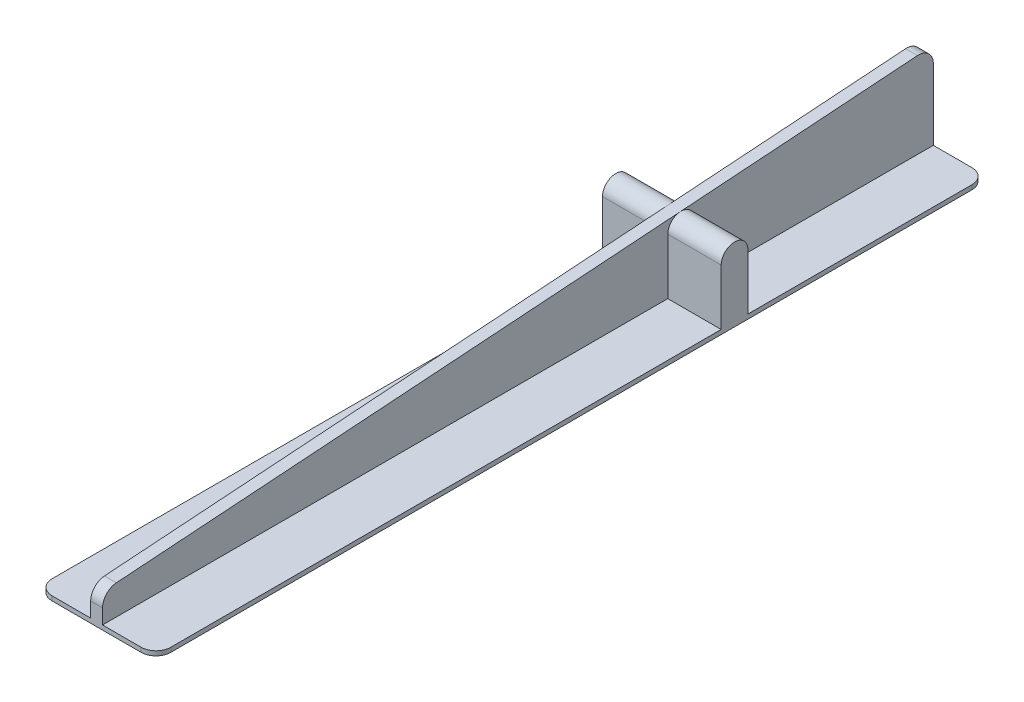
ISO-10303-21;
HEADER;
FILE_DESCRIPTION(('STEP AP214'),'2;1');
FILE_NAME('part.step','',(''),(''),'','','');
FILE_SCHEMA(('AUTOMOTIVE_DESIGN { 1 0 10303 214 1 1 1 1 }'));
ENDSEC;
DATA;
#1=APPLICATION_CONTEXT('core data for automotive mechanical design processes');
#2=APPLICATION_PROTOCOL_DEFINITION('international standard','automotive_design',2000,#1);
#3=PRODUCT_CONTEXT('',#1,'mechanical');
#4=PRODUCT('Part','Part','',(#3));
#5=PRODUCT_RELATED_PRODUCT_CATEGORY('part','',(#4));
#6=PRODUCT_DEFINITION_FORMATION('','',#4);
#7=PRODUCT_DEFINITION_CONTEXT('part definition',#1,'design');
#8=PRODUCT_DEFINITION('design','',#6,#7);
#9=PRODUCT_DEFINITION_SHAPE('','',#8);
#10=(LENGTH_UNIT() NAMED_UNIT(*) SI_UNIT(.MILLI.,.METRE.));
#11=(NAMED_UNIT(*) PLANE_ANGLE_UNIT() SI_UNIT($,.RADIAN.));
#12=(NAMED_UNIT(*) SI_UNIT($,.STERADIAN.) SOLID_ANGLE_UNIT());
#13=UNCERTAINTY_MEASURE_WITH_UNIT(LENGTH_MEASURE(1.E-05),#10,'distance_accuracy_value','');
#14=(GEOMETRIC_REPRESENTATION_CONTEXT(3) GLOBAL_UNCERTAINTY_ASSIGNED_CONTEXT((#13)) GLOBAL_UNIT_ASSIGNED_CONTEXT((#10,
#11,#12)) REPRESENTATION_CONTEXT('',''));
#15=CARTESIAN_POINT('',(0.,0.,0.));
#16=DIRECTION('',(0.,0.,1.));
#17=DIRECTION('',(1.,0.,0.));
#18=AXIS2_PLACEMENT_3D('',#15,#16,#17);
#19=CARTESIAN_POINT('',(-2.,41.5,195.));
#20=DIRECTION('',(1.,0.,0.));
#21=DIRECTION('',(0.,1.,0.));
#22=AXIS2_PLACEMENT_3D('',#19,#20,#21);
#23=PLANE('',#22);
#24=DIRECTION('',(0.,-1.,0.));
#25=VECTOR('',#24,1.);
#26=CARTESIAN_POINT('',(-2.,41.5,195.));
#27=LINE('',#26,#25);
#28=CARTESIAN_POINT('',(-2.,6.5016962403271,195.));
#29=VERTEX_POINT('',#28);
#30=CARTESIAN_POINT('',(-2.00000000000001,1.5,195.));
#31=VERTEX_POINT('',#30);
#32=EDGE_CURVE('E260',#29,#31,#27,.T.);
#33=ORIENTED_EDGE('',*,*,#32,.F.);
#34=CARTESIAN_POINT('',(-2.,6.5016962403271,190.));
#35=DIRECTION('',(1.,0.,0.));
#36=DIRECTION('',(0.,1.,0.));
#37=AXIS2_PLACEMENT_3D('',#34,#35,#36);
#38=CIRCLE('',#37,5.);
#39=CARTESIAN_POINT('',(-2.,11.4895164916262,190.348782368721));
#40=VERTEX_POINT('',#39);
#41=EDGE_CURVE('E11',#29,#40,#38,.F.);
#42=ORIENTED_EDGE('',*,*,#41,.T.);
#43=DIRECTION('',(0.,0.0697564737441257,-0.997564050259824));
#44=VECTOR('',#43,1.);
#45=CARTESIAN_POINT('',(-2.,11.3118842824014,192.889041309287));
#46=LINE('',#45,#44);
#47=CARTESIAN_POINT('',(-2.,24.7780496848039,0.313904131848565));
#48=VERTEX_POINT('',#47);
#49=EDGE_CURVE('E257',#40,#48,#46,.T.);
#50=ORIENTED_EDGE('',*,*,#49,.T.);
#51=CARTESIAN_POINT('',(-2.,20.2890114586347,0.));
#52=DIRECTION('',(1.,0.,0.));
#53=DIRECTION('',(0.,1.,0.));
#54=AXIS2_PLACEMENT_3D('',#51,#52,#53);
#55=CIRCLE('',#54,4.5);
#56=CARTESIAN_POINT('',(-2.,20.2890114586347,4.5));
#57=VERTEX_POINT('',#56);
#58=EDGE_CURVE('E230',#48,#57,#55,.T.);
#59=ORIENTED_EDGE('',*,*,#58,.T.);
#60=DIRECTION('',(0.,-1.,0.));
#61=VECTOR('',#60,1.);
#62=CARTESIAN_POINT('',(-2.,41.5,4.5));
#63=LINE('',#62,#61);
#64=CARTESIAN_POINT('',(-2.00000000000001,1.5,4.5));
#65=VERTEX_POINT('',#64);
#66=EDGE_CURVE('E250',#57,#65,#63,.T.);
#67=ORIENTED_EDGE('',*,*,#66,.T.);
#68=DIRECTION('',(0.,0.,-1.));
#69=VECTOR('',#68,1.);
#70=CARTESIAN_POINT('',(-2.00000000000001,1.5,195.));
#71=LINE('',#70,#69);
#72=EDGE_CURVE('E299',#31,#65,#71,.T.);
#73=ORIENTED_EDGE('',*,*,#72,.F.);
#74=EDGE_LOOP('',(#33,#42,#50,#59,#67,#73));
#75=FACE_BOUND('',#74,.T.);
#76=ADVANCED_FACE('F37',(#75),#23,.F.);
#77=CARTESIAN_POINT('',(-20.,1.5,195.));
#78=DIRECTION('',(0.,-1.,0.));
#79=DIRECTION('',(1.,0.,0.));
#80=AXIS2_PLACEMENT_3D('',#77,#78,#79);
#81=PLANE('',#80);
#82=DIRECTION('',(0.,0.,-1.));
#83=VECTOR('',#82,1.);
#84=CARTESIAN_POINT('',(-20.,1.5,195.));
#85=LINE('',#84,#83);
#86=CARTESIAN_POINT('',(-20.,1.5,190.));
#87=VERTEX_POINT('',#86);
#88=CARTESIAN_POINT('',(-20.,1.5,4.5));
#89=VERTEX_POINT('',#88);
#90=EDGE_CURVE('E296',#87,#89,#85,.T.);
#91=ORIENTED_EDGE('',*,*,#90,.F.);
#92=CARTESIAN_POINT('',(-15.,1.5,190.));
#93=DIRECTION('',(0.,-1.,0.));
#94=DIRECTION('',(1.,0.,0.));
#95=AXIS2_PLACEMENT_3D('',#92,#93,#94);
#96=CIRCLE('',#95,5.);
#97=CARTESIAN_POINT('',(-15.,1.5,195.));
#98=VERTEX_POINT('',#97);
#99=EDGE_CURVE('E350',#87,#98,#96,.F.);
#100=ORIENTED_EDGE('',*,*,#99,.T.);
#101=DIRECTION('',(-1.,0.,0.));
#102=VECTOR('',#101,1.);
#103=CARTESIAN_POINT('',(-20.,1.5,195.));
#104=LINE('',#103,#102);
#105=EDGE_CURVE('E262',#31,#98,#104,.T.);
#106=ORIENTED_EDGE('',*,*,#105,.F.);
#107=ORIENTED_EDGE('',*,*,#72,.T.);
#108=DIRECTION('',(-1.,0.,0.));
#109=VECTOR('',#108,1.);
#110=CARTESIAN_POINT('',(-20.,1.5,4.5));
#111=LINE('',#110,#109);
#112=EDGE_CURVE('E247',#65,#89,#111,.T.);
#113=ORIENTED_EDGE('',*,*,#112,.T.);
#114=EDGE_LOOP('',(#91,#100,#106,#107,#113));
#115=FACE_BOUND('',#114,.T.);
#116=ADVANCED_FACE('F442',(#115),#81,.F.);
#117=CARTESIAN_POINT('',(2.00000000000001,1.5,195.));
#118=DIRECTION('',(0.,-1.,0.));
#119=DIRECTION('',(1.,0.,0.));
#120=AXIS2_PLACEMENT_3D('',#117,#118,#119);
#121=PLANE('',#120);
#122=DIRECTION('',(-1.,0.,0.));
#123=VECTOR('',#122,1.);
#124=CARTESIAN_POINT('',(2.00000000000001,1.5,195.));
#125=LINE('',#124,#123);
#126=CARTESIAN_POINT('',(15.,1.5,195.));
#127=VERTEX_POINT('',#126);
#128=CARTESIAN_POINT('',(2.00000000000001,1.5,195.));
#129=VERTEX_POINT('',#128);
#130=EDGE_CURVE('E269',#127,#129,#125,.T.);
#131=ORIENTED_EDGE('',*,*,#130,.F.);
#132=CARTESIAN_POINT('',(15.,1.5,190.));
#133=DIRECTION('',(0.,-1.,0.));
#134=DIRECTION('',(1.,0.,0.));
#135=AXIS2_PLACEMENT_3D('',#132,#133,#134);
#136=CIRCLE('',#135,5.);
#137=CARTESIAN_POINT('',(20.,1.5,190.));
#138=VERTEX_POINT('',#137);
#139=EDGE_CURVE('E59',#127,#138,#136,.F.);
#140=ORIENTED_EDGE('',*,*,#139,.T.);
#141=DIRECTION('',(0.,0.,-1.));
#142=VECTOR('',#141,1.);
#143=CARTESIAN_POINT('',(20.,1.5,195.));
#144=LINE('',#143,#142);
#145=CARTESIAN_POINT('',(20.,1.5,4.5));
#146=VERTEX_POINT('',#145);
#147=EDGE_CURVE('E288',#138,#146,#144,.T.);
#148=ORIENTED_EDGE('',*,*,#147,.T.);
#149=DIRECTION('',(-1.,0.,0.));
#150=VECTOR('',#149,1.);
#151=CARTESIAN_POINT('',(2.00000000000001,1.5,4.5));
#152=LINE('',#151,#150);
#153=CARTESIAN_POINT('',(2.00000000000001,1.5,4.5));
#154=VERTEX_POINT('',#153);
#155=EDGE_CURVE('E244',#146,#154,#152,.T.);
#156=ORIENTED_EDGE('',*,*,#155,.T.);
#157=DIRECTION('',(0.,0.,-1.));
#158=VECTOR('',#157,1.);
#159=CARTESIAN_POINT('',(2.00000000000001,1.5,195.));
#160=LINE('',#159,#158);
#161=EDGE_CURVE('E285',#129,#154,#160,.T.);
#162=ORIENTED_EDGE('',*,*,#161,.F.);
#163=EDGE_LOOP('',(#131,#140,#148,#156,#162));
#164=FACE_BOUND('',#163,.T.);
#165=ADVANCED_FACE('F355',(#164),#121,.F.);
#166=CARTESIAN_POINT('',(2.,41.5,195.));
#167=DIRECTION('',(-1.,0.,0.));
#168=DIRECTION('',(0.,-1.,0.));
#169=AXIS2_PLACEMENT_3D('',#166,#167,#168);
#170=PLANE('',#169);
#171=DIRECTION('',(0.,0.0697564737441257,-0.997564050259824));
#172=VECTOR('',#171,1.);
#173=CARTESIAN_POINT('',(2.,11.1642716710154,195.));
#174=LINE('',#173,#172);
#175=CARTESIAN_POINT('',(2.,11.4895164916262,190.348782368721));
#176=VERTEX_POINT('',#175);
#177=CARTESIAN_POINT('',(2.,24.7780496848039,0.313904131848565));
#178=VERTEX_POINT('',#177);
#179=EDGE_CURVE('E254',#176,#178,#174,.T.);
#180=ORIENTED_EDGE('',*,*,#179,.F.);
#181=CARTESIAN_POINT('',(2.,6.5016962403271,190.));
#182=DIRECTION('',(-1.,0.,0.));
#183=DIRECTION('',(0.,-1.,0.));
#184=AXIS2_PLACEMENT_3D('',#181,#182,#183);
#185=CIRCLE('',#184,5.);
#186=CARTESIAN_POINT('',(2.,6.5016962403271,195.));
#187=VERTEX_POINT('',#186);
#188=EDGE_CURVE('E45',#176,#187,#185,.F.);
#189=ORIENTED_EDGE('',*,*,#188,.T.);
#190=DIRECTION('',(0.,1.,0.));
#191=VECTOR('',#190,1.);
#192=CARTESIAN_POINT('',(2.,41.5,195.));
#193=LINE('',#192,#191);
#194=EDGE_CURVE('E271',#129,#187,#193,.T.);
#195=ORIENTED_EDGE('',*,*,#194,.F.);
#196=ORIENTED_EDGE('',*,*,#161,.T.);
#197=DIRECTION('',(0.,1.,0.));
#198=VECTOR('',#197,1.);
#199=CARTESIAN_POINT('',(2.,41.5,4.5));
#200=LINE('',#199,#198);
#201=CARTESIAN_POINT('',(2.,20.2890114586347,4.5));
#202=VERTEX_POINT('',#201);
#203=EDGE_CURVE('E303',#154,#202,#200,.T.);
#204=ORIENTED_EDGE('',*,*,#203,.T.);
#205=CARTESIAN_POINT('',(2.,20.2890114586347,0.));
#206=DIRECTION('',(-1.,0.,0.));
#207=DIRECTION('',(0.,-1.,0.));
#208=AXIS2_PLACEMENT_3D('',#205,#206,#207);
#209=CIRCLE('',#208,4.5);
#210=EDGE_CURVE('E232',#202,#178,#209,.T.);
#211=ORIENTED_EDGE('',*,*,#210,.T.);
#212=EDGE_LOOP('',(#180,#189,#195,#196,#204,#211));
#213=FACE_BOUND('',#212,.T.);
#214=ADVANCED_FACE('F403',(#213),#170,.F.);
#215=CARTESIAN_POINT('',(-2.,30.3697557163741,-79.6512176312793));
#216=VERTEX_POINT('',#215);
#217=EDGE_CURVE('E256',#48,#216,#46,.T.);
#218=ORIENTED_EDGE('',*,*,#217,.T.);
#219=CARTESIAN_POINT('',(-2.,25.381935465075,-80.));
#220=DIRECTION('',(1.,0.,0.));
#221=DIRECTION('',(0.,1.,0.));
#222=AXIS2_PLACEMENT_3D('',#219,#220,#221);
#223=CIRCLE('',#222,5.);
#224=CARTESIAN_POINT('',(-2.,25.381935465075,-85.));
#225=VERTEX_POINT('',#224);
#226=EDGE_CURVE('E341',#216,#225,#223,.F.);
#227=ORIENTED_EDGE('',*,*,#226,.T.);
#228=DIRECTION('',(0.,-1.,0.));
#229=VECTOR('',#228,1.);
#230=CARTESIAN_POINT('',(-2.,41.5,-85.));
#231=LINE('',#230,#229);
#232=CARTESIAN_POINT('',(-2.00000000000001,1.5,-85.));
#233=VERTEX_POINT('',#232);
#234=EDGE_CURVE('E259',#225,#233,#231,.T.);
#235=ORIENTED_EDGE('',*,*,#234,.T.);
#236=CARTESIAN_POINT('',(-2.00000000000001,1.5,-4.5));
#237=VERTEX_POINT('',#236);
#238=EDGE_CURVE('E298',#237,#233,#71,.T.);
#239=ORIENTED_EDGE('',*,*,#238,.F.);
#240=DIRECTION('',(0.,1.,0.));
#241=VECTOR('',#240,1.);
#242=CARTESIAN_POINT('',(-2.,41.5,-4.5));
#243=LINE('',#242,#241);
#244=CARTESIAN_POINT('',(-2.,20.2890114586347,-4.5));
#245=VERTEX_POINT('',#244);
#246=EDGE_CURVE('E241',#237,#245,#243,.T.);
#247=ORIENTED_EDGE('',*,*,#246,.T.);
#248=EDGE_CURVE('E235',#245,#48,#55,.T.);
#249=ORIENTED_EDGE('',*,*,#248,.T.);
#250=EDGE_LOOP('',(#218,#227,#235,#239,#247,#249));
#251=FACE_BOUND('',#250,.T.);
#252=ADVANCED_FACE('F408',(#251),#23,.F.);
#253=DIRECTION('',(-1.,0.,0.));
#254=VECTOR('',#253,1.);
#255=CARTESIAN_POINT('',(-20.,1.5,-85.));
#256=LINE('',#255,#254);
#257=CARTESIAN_POINT('',(-15.,1.5,-85.));
#258=VERTEX_POINT('',#257);
#259=EDGE_CURVE('E275',#233,#258,#256,.T.);
#260=ORIENTED_EDGE('',*,*,#259,.T.);
#261=CARTESIAN_POINT('',(-15.,1.5,-80.));
#262=DIRECTION('',(0.,-1.,0.));
#263=DIRECTION('',(1.,0.,0.));
#264=AXIS2_PLACEMENT_3D('',#261,#262,#263);
#265=CIRCLE('',#264,5.);
#266=CARTESIAN_POINT('',(-20.,1.5,-80.));
#267=VERTEX_POINT('',#266);
#268=EDGE_CURVE('E326',#258,#267,#265,.F.);
#269=ORIENTED_EDGE('',*,*,#268,.T.);
#270=CARTESIAN_POINT('',(-20.,1.5,-4.5));
#271=VERTEX_POINT('',#270);
#272=EDGE_CURVE('E295',#271,#267,#85,.T.);
#273=ORIENTED_EDGE('',*,*,#272,.F.);
#274=DIRECTION('',(1.,0.,0.));
#275=VECTOR('',#274,1.);
#276=CARTESIAN_POINT('',(-20.,1.5,-4.5));
#277=LINE('',#276,#275);
#278=EDGE_CURVE('E238',#271,#237,#277,.T.);
#279=ORIENTED_EDGE('',*,*,#278,.T.);
#280=ORIENTED_EDGE('',*,*,#238,.T.);
#281=EDGE_LOOP('',(#260,#269,#273,#279,#280));
#282=FACE_BOUND('',#281,.T.);
#283=ADVANCED_FACE('F425',(#282),#81,.F.);
#284=CARTESIAN_POINT('',(-20.,0.,195.));
#285=DIRECTION('',(1.,0.,0.));
#286=DIRECTION('',(0.,0.,-1.));
#287=AXIS2_PLACEMENT_3D('',#284,#285,#286);
#288=PLANE('',#287);
#289=ORIENTED_EDGE('',*,*,#272,.T.);
#290=DIRECTION('',(0.,-1.,0.));
#291=VECTOR('',#290,1.);
#292=CARTESIAN_POINT('',(-20.,0.,-80.));
#293=LINE('',#292,#291);
#294=CARTESIAN_POINT('',(-20.,0.,-80.));
#295=VERTEX_POINT('',#294);
#296=EDGE_CURVE('E308',#267,#295,#293,.T.);
#297=ORIENTED_EDGE('',*,*,#296,.T.);
#298=DIRECTION('',(0.,0.,-1.));
#299=VECTOR('',#298,1.);
#300=CARTESIAN_POINT('',(-20.,0.,195.));
#301=LINE('',#300,#299);
#302=CARTESIAN_POINT('',(-20.,0.,190.));
#303=VERTEX_POINT('',#302);
#304=EDGE_CURVE('E292',#303,#295,#301,.T.);
#305=ORIENTED_EDGE('',*,*,#304,.F.);
#306=DIRECTION('',(0.,-1.,0.));
#307=VECTOR('',#306,1.);
#308=CARTESIAN_POINT('',(-20.,1.5,190.));
#309=LINE('',#308,#307);
#310=EDGE_CURVE('E306',#303,#87,#309,.F.);
#311=ORIENTED_EDGE('',*,*,#310,.T.);
#312=ORIENTED_EDGE('',*,*,#90,.T.);
#313=DIRECTION('',(0.,1.,0.));
#314=VECTOR('',#313,1.);
#315=CARTESIAN_POINT('',(-20.,0.,4.5));
#316=LINE('',#315,#314);
#317=CARTESIAN_POINT('',(-20.,20.2890114586347,4.5));
#318=VERTEX_POINT('',#317);
#319=EDGE_CURVE('E231',#89,#318,#316,.T.);
#320=ORIENTED_EDGE('',*,*,#319,.T.);
#321=CARTESIAN_POINT('',(-20.,20.2890114586347,0.));
#322=DIRECTION('',(1.,0.,0.));
#323=DIRECTION('',(0.,0.,-1.));
#324=AXIS2_PLACEMENT_3D('',#321,#322,#323);
#325=CIRCLE('',#324,4.5);
#326=CARTESIAN_POINT('',(-20.,20.2890114586347,-4.5));
#327=VERTEX_POINT('',#326);
#328=EDGE_CURVE('E432',#318,#327,#325,.F.);
#329=ORIENTED_EDGE('',*,*,#328,.T.);
#330=DIRECTION('',(0.,-1.,0.));
#331=VECTOR('',#330,1.);
#332=CARTESIAN_POINT('',(-20.,0.,-4.5));
#333=LINE('',#332,#331);
#334=EDGE_CURVE('E225',#327,#271,#333,.T.);
#335=ORIENTED_EDGE('',*,*,#334,.T.);
#336=EDGE_LOOP('',(#289,#297,#305,#311,#312,#320,#329,#335));
#337=FACE_BOUND('',#336,.T.);
#338=ADVANCED_FACE('F375',(#337),#288,.F.);
#339=CARTESIAN_POINT('',(-20.,0.,195.));
#340=DIRECTION('',(0.,1.,0.));
#341=DIRECTION('',(0.,0.,1.));
#342=AXIS2_PLACEMENT_3D('',#339,#340,#341);
#343=PLANE('',#342);
#344=ORIENTED_EDGE('',*,*,#304,.T.);
#345=CARTESIAN_POINT('',(-15.,0.,-80.));
#346=DIRECTION('',(0.,1.,0.));
#347=DIRECTION('',(0.,0.,1.));
#348=AXIS2_PLACEMENT_3D('',#345,#346,#347);
#349=CIRCLE('',#348,5.);
#350=CARTESIAN_POINT('',(-15.,0.,-85.));
#351=VERTEX_POINT('',#350);
#352=EDGE_CURVE('E317',#295,#351,#349,.F.);
#353=ORIENTED_EDGE('',*,*,#352,.T.);
#354=DIRECTION('',(1.,0.,0.));
#355=VECTOR('',#354,1.);
#356=CARTESIAN_POINT('',(-20.,0.,-85.));
#357=LINE('',#356,#355);
#358=CARTESIAN_POINT('',(15.,0.,-85.));
#359=VERTEX_POINT('',#358);
#360=EDGE_CURVE('E278',#351,#359,#357,.T.);
#361=ORIENTED_EDGE('',*,*,#360,.T.);
#362=CARTESIAN_POINT('',(15.,0.,-80.));
#363=DIRECTION('',(0.,1.,0.));
#364=DIRECTION('',(0.,0.,1.));
#365=AXIS2_PLACEMENT_3D('',#362,#363,#364);
#366=CIRCLE('',#365,5.);
#367=CARTESIAN_POINT('',(20.,0.,-80.));
#368=VERTEX_POINT('',#367);
#369=EDGE_CURVE('E315',#359,#368,#366,.F.);
#370=ORIENTED_EDGE('',*,*,#369,.T.);
#371=DIRECTION('',(0.,0.,-1.));
#372=VECTOR('',#371,1.);
#373=CARTESIAN_POINT('',(20.,0.,195.));
#374=LINE('',#373,#372);
#375=CARTESIAN_POINT('',(20.,0.,190.));
#376=VERTEX_POINT('',#375);
#377=EDGE_CURVE('E290',#376,#368,#374,.T.);
#378=ORIENTED_EDGE('',*,*,#377,.F.);
#379=CARTESIAN_POINT('',(15.,0.,190.));
#380=DIRECTION('',(0.,1.,0.));
#381=DIRECTION('',(0.,0.,1.));
#382=AXIS2_PLACEMENT_3D('',#379,#380,#381);
#383=CIRCLE('',#382,5.);
#384=CARTESIAN_POINT('',(15.,0.,195.));
#385=VERTEX_POINT('',#384);
#386=EDGE_CURVE('E311',#376,#385,#383,.F.);
#387=ORIENTED_EDGE('',*,*,#386,.T.);
#388=DIRECTION('',(1.,0.,0.));
#389=VECTOR('',#388,1.);
#390=CARTESIAN_POINT('',(-20.,0.,195.));
#391=LINE('',#390,#389);
#392=CARTESIAN_POINT('',(-15.,0.,195.));
#393=VERTEX_POINT('',#392);
#394=EDGE_CURVE('E266',#393,#385,#391,.T.);
#395=ORIENTED_EDGE('',*,*,#394,.F.);
#396=CARTESIAN_POINT('',(-15.,0.,190.));
#397=DIRECTION('',(0.,1.,0.));
#398=DIRECTION('',(0.,0.,1.));
#399=AXIS2_PLACEMENT_3D('',#396,#397,#398);
#400=CIRCLE('',#399,5.);
#401=EDGE_CURVE('E313',#393,#303,#400,.F.);
#402=ORIENTED_EDGE('',*,*,#401,.T.);
#403=EDGE_LOOP('',(#344,#353,#361,#370,#378,#387,#395,#402));
#404=FACE_BOUND('',#403,.T.);
#405=ADVANCED_FACE('F363',(#404),#343,.F.);
#406=CARTESIAN_POINT('',(20.,0.,195.));
#407=DIRECTION('',(-1.,0.,0.));
#408=DIRECTION('',(0.,0.,1.));
#409=AXIS2_PLACEMENT_3D('',#406,#407,#408);
#410=PLANE('',#409);
#411=ORIENTED_EDGE('',*,*,#377,.T.);
#412=DIRECTION('',(0.,1.,0.));
#413=VECTOR('',#412,1.);
#414=CARTESIAN_POINT('',(20.,0.,-80.));
#415=LINE('',#414,#413);
#416=CARTESIAN_POINT('',(20.,1.5,-80.));
#417=VERTEX_POINT('',#416);
#418=EDGE_CURVE('E330',#368,#417,#415,.T.);
#419=ORIENTED_EDGE('',*,*,#418,.T.);
#420=CARTESIAN_POINT('',(20.,1.5,-4.5));
#421=VERTEX_POINT('',#420);
#422=EDGE_CURVE('E201',#421,#417,#144,.T.);
#423=ORIENTED_EDGE('',*,*,#422,.F.);
#424=DIRECTION('',(0.,1.,0.));
#425=VECTOR('',#424,1.);
#426=CARTESIAN_POINT('',(20.,0.,-4.5));
#427=LINE('',#426,#425);
#428=CARTESIAN_POINT('',(20.,20.2890114586347,-4.5));
#429=VERTEX_POINT('',#428);
#430=EDGE_CURVE('E192',#421,#429,#427,.T.);
#431=ORIENTED_EDGE('',*,*,#430,.T.);
#432=CARTESIAN_POINT('',(20.,20.2890114586347,0.));
#433=DIRECTION('',(1.,0.,0.));
#434=DIRECTION('',(0.,0.,-1.));
#435=AXIS2_PLACEMENT_3D('',#432,#433,#434);
#436=CIRCLE('',#435,4.5);
#437=CARTESIAN_POINT('',(20.,20.2890114586347,4.5));
#438=VERTEX_POINT('',#437);
#439=EDGE_CURVE('E198',#429,#438,#436,.T.);
#440=ORIENTED_EDGE('',*,*,#439,.T.);
#441=DIRECTION('',(0.,-1.,0.));
#442=VECTOR('',#441,1.);
#443=CARTESIAN_POINT('',(20.,0.,4.5));
#444=LINE('',#443,#442);
#445=EDGE_CURVE('E204',#438,#146,#444,.T.);
#446=ORIENTED_EDGE('',*,*,#445,.T.);
#447=ORIENTED_EDGE('',*,*,#147,.F.);
#448=DIRECTION('',(0.,1.,0.));
#449=VECTOR('',#448,1.);
#450=CARTESIAN_POINT('',(20.,0.,190.));
#451=LINE('',#450,#449);
#452=EDGE_CURVE('E328',#138,#376,#451,.F.);
#453=ORIENTED_EDGE('',*,*,#452,.T.);
#454=EDGE_LOOP('',(#411,#419,#423,#431,#440,#446,#447,#453));
#455=FACE_BOUND('',#454,.T.);
#456=ADVANCED_FACE('F195',(#455),#410,.F.);
#457=ORIENTED_EDGE('',*,*,#422,.T.);
#458=CARTESIAN_POINT('',(15.,1.5,-80.));
#459=DIRECTION('',(0.,-1.,0.));
#460=DIRECTION('',(1.,0.,0.));
#461=AXIS2_PLACEMENT_3D('',#458,#459,#460);
#462=CIRCLE('',#461,5.);
#463=CARTESIAN_POINT('',(15.,1.5,-85.));
#464=VERTEX_POINT('',#463);
#465=EDGE_CURVE('E332',#417,#464,#462,.F.);
#466=ORIENTED_EDGE('',*,*,#465,.T.);
#467=DIRECTION('',(-1.,0.,0.));
#468=VECTOR('',#467,1.);
#469=CARTESIAN_POINT('',(2.00000000000001,1.5,-85.));
#470=LINE('',#469,#468);
#471=CARTESIAN_POINT('',(2.00000000000001,1.5,-85.));
#472=VERTEX_POINT('',#471);
#473=EDGE_CURVE('E281',#464,#472,#470,.T.);
#474=ORIENTED_EDGE('',*,*,#473,.T.);
#475=CARTESIAN_POINT('',(2.00000000000001,1.5,-4.5));
#476=VERTEX_POINT('',#475);
#477=EDGE_CURVE('E273',#476,#472,#160,.T.);
#478=ORIENTED_EDGE('',*,*,#477,.F.);
#479=DIRECTION('',(1.,0.,0.));
#480=VECTOR('',#479,1.);
#481=CARTESIAN_POINT('',(2.00000000000001,1.5,-4.5));
#482=LINE('',#481,#480);
#483=EDGE_CURVE('E236',#476,#421,#482,.T.);
#484=ORIENTED_EDGE('',*,*,#483,.T.);
#485=EDGE_LOOP('',(#457,#466,#474,#478,#484));
#486=FACE_BOUND('',#485,.T.);
#487=ADVANCED_FACE('F395',(#486),#121,.F.);
#488=DIRECTION('',(0.,1.,0.));
#489=VECTOR('',#488,1.);
#490=CARTESIAN_POINT('',(2.,41.5,-85.));
#491=LINE('',#490,#489);
#492=CARTESIAN_POINT('',(2.,25.381935465075,-85.));
#493=VERTEX_POINT('',#492);
#494=EDGE_CURVE('E263',#472,#493,#491,.T.);
#495=ORIENTED_EDGE('',*,*,#494,.T.);
#496=CARTESIAN_POINT('',(2.,25.381935465075,-80.));
#497=DIRECTION('',(-1.,0.,0.));
#498=DIRECTION('',(0.,-1.,0.));
#499=AXIS2_PLACEMENT_3D('',#496,#497,#498);
#500=CIRCLE('',#499,5.);
#501=CARTESIAN_POINT('',(2.,30.3697557163741,-79.6512176312793));
#502=VERTEX_POINT('',#501);
#503=EDGE_CURVE('E334',#493,#502,#500,.F.);
#504=ORIENTED_EDGE('',*,*,#503,.T.);
#505=EDGE_CURVE('E253',#178,#502,#174,.T.);
#506=ORIENTED_EDGE('',*,*,#505,.F.);
#507=CARTESIAN_POINT('',(2.,20.2890114586347,-4.5));
#508=VERTEX_POINT('',#507);
#509=EDGE_CURVE('E228',#178,#508,#209,.T.);
#510=ORIENTED_EDGE('',*,*,#509,.T.);
#511=DIRECTION('',(0.,-1.,0.));
#512=VECTOR('',#511,1.);
#513=CARTESIAN_POINT('',(2.,41.5,-4.5));
#514=LINE('',#513,#512);
#515=EDGE_CURVE('E210',#508,#476,#514,.T.);
#516=ORIENTED_EDGE('',*,*,#515,.T.);
#517=ORIENTED_EDGE('',*,*,#477,.T.);
#518=EDGE_LOOP('',(#495,#504,#506,#510,#516,#517));
#519=FACE_BOUND('',#518,.T.);
#520=ADVANCED_FACE('F399',(#519),#170,.F.);
#521=CARTESIAN_POINT('',(0.,0.,195.));
#522=DIRECTION('',(0.,0.,1.));
#523=DIRECTION('',(1.,0.,0.));
#524=AXIS2_PLACEMENT_3D('',#521,#522,#523);
#525=PLANE('',#524);
#526=ORIENTED_EDGE('',*,*,#105,.T.);
#527=DIRECTION('',(0.,-1.,0.));
#528=VECTOR('',#527,1.);
#529=CARTESIAN_POINT('',(-15.,0.,195.));
#530=LINE('',#529,#528);
#531=EDGE_CURVE('E347',#98,#393,#530,.T.);
#532=ORIENTED_EDGE('',*,*,#531,.T.);
#533=ORIENTED_EDGE('',*,*,#394,.T.);
#534=DIRECTION('',(0.,1.,0.));
#535=VECTOR('',#534,1.);
#536=CARTESIAN_POINT('',(15.,1.5,195.));
#537=LINE('',#536,#535);
#538=EDGE_CURVE('E345',#385,#127,#537,.T.);
#539=ORIENTED_EDGE('',*,*,#538,.T.);
#540=ORIENTED_EDGE('',*,*,#130,.T.);
#541=ORIENTED_EDGE('',*,*,#194,.T.);
#542=DIRECTION('',(1.,0.,0.));
#543=VECTOR('',#542,1.);
#544=CARTESIAN_POINT('',(-2.,6.5016962403271,195.));
#545=LINE('',#544,#543);
#546=EDGE_CURVE('E343',#187,#29,#545,.F.);
#547=ORIENTED_EDGE('',*,*,#546,.T.);
#548=ORIENTED_EDGE('',*,*,#32,.T.);
#549=EDGE_LOOP('',(#526,#532,#533,#539,#540,#541,#547,#548));
#550=FACE_BOUND('',#549,.T.);
#551=ADVANCED_FACE('F365',(#550),#525,.T.);
#552=CARTESIAN_POINT('',(0.,0.,-85.));
#553=DIRECTION('',(0.,0.,1.));
#554=DIRECTION('',(1.,0.,0.));
#555=AXIS2_PLACEMENT_3D('',#552,#553,#554);
#556=PLANE('',#555);
#557=ORIENTED_EDGE('',*,*,#360,.F.);
#558=DIRECTION('',(0.,-1.,0.));
#559=VECTOR('',#558,1.);
#560=CARTESIAN_POINT('',(-15.,0.,-85.));
#561=LINE('',#560,#559);
#562=EDGE_CURVE('E324',#351,#258,#561,.F.);
#563=ORIENTED_EDGE('',*,*,#562,.T.);
#564=ORIENTED_EDGE('',*,*,#259,.F.);
#565=ORIENTED_EDGE('',*,*,#234,.F.);
#566=DIRECTION('',(1.,0.,0.));
#567=VECTOR('',#566,1.);
#568=CARTESIAN_POINT('',(0.,25.381935465075,-85.));
#569=LINE('',#568,#567);
#570=EDGE_CURVE('E319',#225,#493,#569,.T.);
#571=ORIENTED_EDGE('',*,*,#570,.T.);
#572=ORIENTED_EDGE('',*,*,#494,.F.);
#573=ORIENTED_EDGE('',*,*,#473,.F.);
#574=DIRECTION('',(0.,1.,0.));
#575=VECTOR('',#574,1.);
#576=CARTESIAN_POINT('',(15.,0.,-85.));
#577=LINE('',#576,#575);
#578=EDGE_CURVE('E322',#464,#359,#577,.F.);
#579=ORIENTED_EDGE('',*,*,#578,.T.);
#580=EDGE_LOOP('',(#557,#563,#564,#565,#571,#572,#573,#579));
#581=FACE_BOUND('',#580,.T.);
#582=ADVANCED_FACE('F386',(#581),#556,.F.);
#583=CARTESIAN_POINT('',(-20.,11.1642716710154,195.));
#584=DIRECTION('',(0.,-0.997564050259824,-0.0697564737441257));
#585=DIRECTION('',(0.,0.0697564737441257,-0.997564050259824));
#586=AXIS2_PLACEMENT_3D('',#583,#584,#585);
#587=PLANE('',#586);
#588=ORIENTED_EDGE('',*,*,#505,.T.);
#589=DIRECTION('',(1.,0.,0.));
#590=VECTOR('',#589,1.);
#591=CARTESIAN_POINT('',(-20.,30.3697557163741,-79.6512176312793));
#592=LINE('',#591,#590);
#593=EDGE_CURVE('E339',#502,#216,#592,.F.);
#594=ORIENTED_EDGE('',*,*,#593,.T.);
#595=ORIENTED_EDGE('',*,*,#217,.F.);
#596=ORIENTED_EDGE('',*,*,#49,.F.);
#597=DIRECTION('',(1.,0.,0.));
#598=VECTOR('',#597,1.);
#599=CARTESIAN_POINT('',(2.,11.4895164916262,190.348782368721));
#600=LINE('',#599,#598);
#601=EDGE_CURVE('E336',#40,#176,#600,.T.);
#602=ORIENTED_EDGE('',*,*,#601,.T.);
#603=ORIENTED_EDGE('',*,*,#179,.T.);
#604=EDGE_LOOP('',(#588,#594,#595,#596,#602,#603));
#605=FACE_BOUND('',#604,.T.);
#606=ADVANCED_FACE('F416',(#605),#587,.F.);
#607=CARTESIAN_POINT('',(-46.3722408812054,0.,-4.5));
#608=DIRECTION('',(0.,0.,-1.));
#609=DIRECTION('',(0.,1.,0.));
#610=AXIS2_PLACEMENT_3D('',#607,#608,#609);
#611=PLANE('',#610);
#612=ORIENTED_EDGE('',*,*,#483,.F.);
#613=ORIENTED_EDGE('',*,*,#515,.F.);
#614=DIRECTION('',(1.,0.,0.));
#615=VECTOR('',#614,1.);
#616=CARTESIAN_POINT('',(-46.3722408812054,20.2890114586347,-4.5));
#617=LINE('',#616,#615);
#618=EDGE_CURVE('E207',#508,#429,#617,.T.);
#619=ORIENTED_EDGE('',*,*,#618,.T.);
#620=ORIENTED_EDGE('',*,*,#430,.F.);
#621=EDGE_LOOP('',(#612,#613,#619,#620));
#622=FACE_BOUND('',#621,.T.);
#623=ADVANCED_FACE('F208',(#622),#611,.T.);
#624=CARTESIAN_POINT('',(-46.3722408812054,20.2890114586347,0.));
#625=DIRECTION('',(1.,0.,0.));
#626=DIRECTION('',(0.,0.,-1.));
#627=AXIS2_PLACEMENT_3D('',#624,#625,#626);
#628=CYLINDRICAL_SURFACE('',#627,4.5);
#629=ORIENTED_EDGE('',*,*,#210,.F.);
#630=DIRECTION('',(1.,0.,0.));
#631=VECTOR('',#630,1.);
#632=CARTESIAN_POINT('',(-46.3722408812054,20.2890114586347,4.5));
#633=LINE('',#632,#631);
#634=EDGE_CURVE('E218',#202,#438,#633,.T.);
#635=ORIENTED_EDGE('',*,*,#634,.T.);
#636=ORIENTED_EDGE('',*,*,#439,.F.);
#637=ORIENTED_EDGE('',*,*,#618,.F.);
#638=ORIENTED_EDGE('',*,*,#509,.F.);
#639=EDGE_LOOP('',(#629,#635,#636,#637,#638));
#640=FACE_BOUND('',#639,.T.);
#641=ADVANCED_FACE('F216',(#640),#628,.T.);
#642=CARTESIAN_POINT('',(-46.3722408812054,0.,4.5));
#643=DIRECTION('',(0.,0.,1.));
#644=DIRECTION('',(0.,-1.,0.));
#645=AXIS2_PLACEMENT_3D('',#642,#643,#644);
#646=PLANE('',#645);
#647=ORIENTED_EDGE('',*,*,#155,.F.);
#648=ORIENTED_EDGE('',*,*,#445,.F.);
#649=ORIENTED_EDGE('',*,*,#634,.F.);
#650=ORIENTED_EDGE('',*,*,#203,.F.);
#651=EDGE_LOOP('',(#647,#648,#649,#650));
#652=FACE_BOUND('',#651,.T.);
#653=ADVANCED_FACE('F481',(#652),#646,.T.);
#654=ORIENTED_EDGE('',*,*,#66,.F.);
#655=EDGE_CURVE('E223',#318,#57,#633,.T.);
#656=ORIENTED_EDGE('',*,*,#655,.F.);
#657=ORIENTED_EDGE('',*,*,#319,.F.);
#658=ORIENTED_EDGE('',*,*,#112,.F.);
#659=EDGE_LOOP('',(#654,#656,#657,#658));
#660=FACE_BOUND('',#659,.T.);
#661=ADVANCED_FACE('F437',(#660),#646,.T.);
#662=ORIENTED_EDGE('',*,*,#246,.F.);
#663=ORIENTED_EDGE('',*,*,#278,.F.);
#664=ORIENTED_EDGE('',*,*,#334,.F.);
#665=EDGE_CURVE('E214',#327,#245,#617,.T.);
#666=ORIENTED_EDGE('',*,*,#665,.T.);
#667=EDGE_LOOP('',(#662,#663,#664,#666));
#668=FACE_BOUND('',#667,.T.);
#669=ADVANCED_FACE('F429',(#668),#611,.T.);
#670=ORIENTED_EDGE('',*,*,#248,.F.);
#671=ORIENTED_EDGE('',*,*,#665,.F.);
#672=ORIENTED_EDGE('',*,*,#328,.F.);
#673=ORIENTED_EDGE('',*,*,#655,.T.);
#674=ORIENTED_EDGE('',*,*,#58,.F.);
#675=EDGE_LOOP('',(#670,#671,#672,#673,#674));
#676=FACE_BOUND('',#675,.T.);
#677=ADVANCED_FACE('F431',(#676),#628,.T.);
#678=CARTESIAN_POINT('',(-15.,0.,-80.));
#679=DIRECTION('',(0.,-1.,0.));
#680=DIRECTION('',(0.,0.,-1.));
#681=AXIS2_PLACEMENT_3D('',#678,#679,#680);
#682=CYLINDRICAL_SURFACE('',#681,5.);
#683=ORIENTED_EDGE('',*,*,#268,.F.);
#684=ORIENTED_EDGE('',*,*,#562,.F.);
#685=ORIENTED_EDGE('',*,*,#352,.F.);
#686=ORIENTED_EDGE('',*,*,#296,.F.);
#687=EDGE_LOOP('',(#683,#684,#685,#686));
#688=FACE_BOUND('',#687,.T.);
#689=ADVANCED_FACE('F381',(#688),#682,.T.);
#690=CARTESIAN_POINT('',(15.,0.,-80.));
#691=DIRECTION('',(0.,1.,0.));
#692=DIRECTION('',(0.,0.,1.));
#693=AXIS2_PLACEMENT_3D('',#690,#691,#692);
#694=CYLINDRICAL_SURFACE('',#693,5.);
#695=ORIENTED_EDGE('',*,*,#369,.F.);
#696=ORIENTED_EDGE('',*,*,#578,.F.);
#697=ORIENTED_EDGE('',*,*,#465,.F.);
#698=ORIENTED_EDGE('',*,*,#418,.F.);
#699=EDGE_LOOP('',(#695,#696,#697,#698));
#700=FACE_BOUND('',#699,.T.);
#701=ADVANCED_FACE('F392',(#700),#694,.T.);
#702=CARTESIAN_POINT('',(0.,25.381935465075,-80.));
#703=DIRECTION('',(1.,0.,0.));
#704=DIRECTION('',(0.,1.,0.));
#705=AXIS2_PLACEMENT_3D('',#702,#703,#704);
#706=CYLINDRICAL_SURFACE('',#705,5.);
#707=ORIENTED_EDGE('',*,*,#226,.F.);
#708=ORIENTED_EDGE('',*,*,#593,.F.);
#709=ORIENTED_EDGE('',*,*,#503,.F.);
#710=ORIENTED_EDGE('',*,*,#570,.F.);
#711=EDGE_LOOP('',(#707,#708,#709,#710));
#712=FACE_BOUND('',#711,.T.);
#713=ADVANCED_FACE('F420',(#712),#706,.T.);
#714=CARTESIAN_POINT('',(-15.,0.,190.));
#715=DIRECTION('',(0.,1.,0.));
#716=DIRECTION('',(0.,0.,1.));
#717=AXIS2_PLACEMENT_3D('',#714,#715,#716);
#718=CYLINDRICAL_SURFACE('',#717,5.);
#719=ORIENTED_EDGE('',*,*,#99,.F.);
#720=ORIENTED_EDGE('',*,*,#310,.F.);
#721=ORIENTED_EDGE('',*,*,#401,.F.);
#722=ORIENTED_EDGE('',*,*,#531,.F.);
#723=EDGE_LOOP('',(#719,#720,#721,#722));
#724=FACE_BOUND('',#723,.T.);
#725=ADVANCED_FACE('F370',(#724),#718,.T.);
#726=CARTESIAN_POINT('',(15.,0.,190.));
#727=DIRECTION('',(0.,-1.,0.));
#728=DIRECTION('',(0.,0.,-1.));
#729=AXIS2_PLACEMENT_3D('',#726,#727,#728);
#730=CYLINDRICAL_SURFACE('',#729,5.);
#731=ORIENTED_EDGE('',*,*,#386,.F.);
#732=ORIENTED_EDGE('',*,*,#452,.F.);
#733=ORIENTED_EDGE('',*,*,#139,.F.);
#734=ORIENTED_EDGE('',*,*,#538,.F.);
#735=EDGE_LOOP('',(#731,#732,#733,#734));
#736=FACE_BOUND('',#735,.T.);
#737=ADVANCED_FACE('F360',(#736),#730,.T.);
#738=CARTESIAN_POINT('',(-20.,6.5016962403271,190.));
#739=DIRECTION('',(-1.,0.,0.));
#740=DIRECTION('',(0.,-1.,0.));
#741=AXIS2_PLACEMENT_3D('',#738,#739,#740);
#742=CYLINDRICAL_SURFACE('',#741,5.);
#743=ORIENTED_EDGE('',*,*,#41,.F.);
#744=ORIENTED_EDGE('',*,*,#546,.F.);
#745=ORIENTED_EDGE('',*,*,#188,.F.);
#746=ORIENTED_EDGE('',*,*,#601,.F.);
#747=EDGE_LOOP('',(#743,#744,#745,#746));
#748=FACE_BOUND('',#747,.T.);
#749=ADVANCED_FACE('F39',(#748),#742,.T.);
#750=CLOSED_SHELL('',(#76,#116,#165,#214,#252,#283,#338,#405,#456,#487,#520,#551,#582,#606,#623,
#641,#653,#661,#669,#677,#689,#701,#713,#725,#737,#749));
#751=MANIFOLD_SOLID_BREP('B2',#750);
#752=ADVANCED_BREP_SHAPE_REPRESENTATION('',(#18,#751),#14);
#753=SHAPE_DEFINITION_REPRESENTATION(#9,#752);
ENDSEC;
END-ISO-10303-21;
